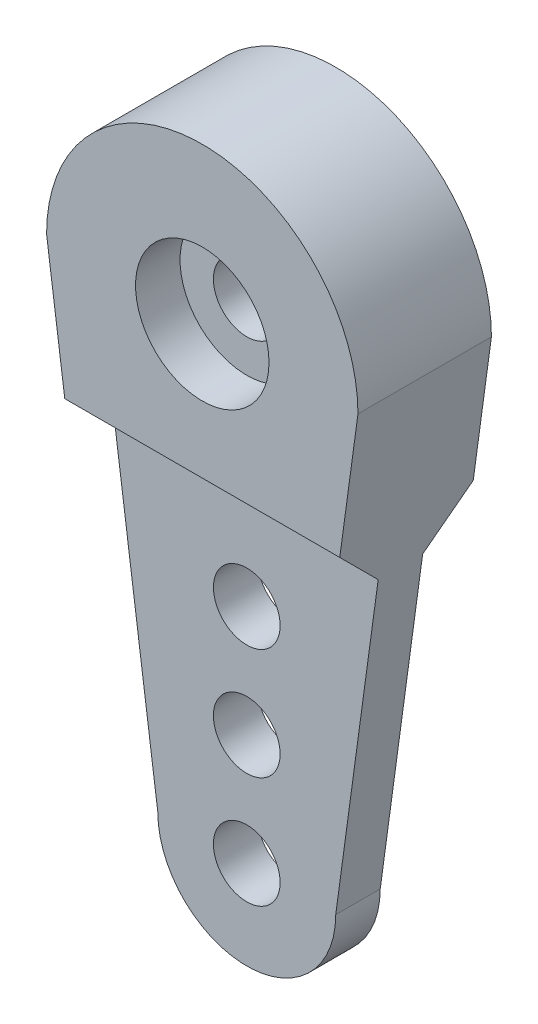
ISO-10303-21;
HEADER;
FILE_DESCRIPTION(('STEP AP214'),'2;1');
FILE_NAME('part.step','',(''),(''),'','','');
FILE_SCHEMA(('AUTOMOTIVE_DESIGN { 1 0 10303 214 1 1 1 1 }'));
ENDSEC;
DATA;
#1=APPLICATION_CONTEXT('core data for automotive mechanical design processes');
#2=APPLICATION_PROTOCOL_DEFINITION('international standard','automotive_design',2000,#1);
#3=PRODUCT_CONTEXT('',#1,'mechanical');
#4=PRODUCT('Part','Part','',(#3));
#5=PRODUCT_RELATED_PRODUCT_CATEGORY('part','',(#4));
#6=PRODUCT_DEFINITION_FORMATION('','',#4);
#7=PRODUCT_DEFINITION_CONTEXT('part definition',#1,'design');
#8=PRODUCT_DEFINITION('design','',#6,#7);
#9=PRODUCT_DEFINITION_SHAPE('','',#8);
#10=(LENGTH_UNIT() NAMED_UNIT(*) SI_UNIT(.MILLI.,.METRE.));
#11=(NAMED_UNIT(*) PLANE_ANGLE_UNIT() SI_UNIT($,.RADIAN.));
#12=(NAMED_UNIT(*) SI_UNIT($,.STERADIAN.) SOLID_ANGLE_UNIT());
#13=UNCERTAINTY_MEASURE_WITH_UNIT(LENGTH_MEASURE(1.E-05),#10,'distance_accuracy_value','');
#14=(GEOMETRIC_REPRESENTATION_CONTEXT(3) GLOBAL_UNCERTAINTY_ASSIGNED_CONTEXT((#13)) GLOBAL_UNIT_ASSIGNED_CONTEXT((#10,
#11,#12)) REPRESENTATION_CONTEXT('',''));
#15=CARTESIAN_POINT('',(0.,0.,0.));
#16=DIRECTION('',(0.,0.,1.));
#17=DIRECTION('',(1.,0.,0.));
#18=AXIS2_PLACEMENT_3D('',#15,#16,#17);
#19=CARTESIAN_POINT('',(0.,0.,1.));
#20=DIRECTION('',(0.,0.,-1.));
#21=DIRECTION('',(-1.,0.,0.));
#22=AXIS2_PLACEMENT_3D('',#19,#20,#21);
#23=CYLINDRICAL_SURFACE('',#22,7.);
#24=DIRECTION('',(0.,0.,-1.));
#25=VECTOR('',#24,1.);
#26=CARTESIAN_POINT('',(7.,0.,1.));
#27=LINE('',#26,#25);
#28=CARTESIAN_POINT('',(7.,0.,3.));
#29=VERTEX_POINT('',#28);
#30=CARTESIAN_POINT('',(7.,0.,-3.));
#31=VERTEX_POINT('',#30);
#32=EDGE_CURVE('E183',#29,#31,#27,.T.);
#33=ORIENTED_EDGE('',*,*,#32,.T.);
#34=CARTESIAN_POINT('',(0.,0.,-3.));
#35=DIRECTION('',(0.,0.,1.));
#36=DIRECTION('',(1.,0.,0.));
#37=AXIS2_PLACEMENT_3D('',#34,#35,#36);
#38=CIRCLE('',#37,7.);
#39=CARTESIAN_POINT('',(-7.,0.,-3.));
#40=VERTEX_POINT('',#39);
#41=EDGE_CURVE('E122',#31,#40,#38,.T.);
#42=ORIENTED_EDGE('',*,*,#41,.T.);
#43=DIRECTION('',(0.,0.,-1.));
#44=VECTOR('',#43,1.);
#45=CARTESIAN_POINT('',(-7.,0.,1.));
#46=LINE('',#45,#44);
#47=CARTESIAN_POINT('',(-7.,0.,3.));
#48=VERTEX_POINT('',#47);
#49=EDGE_CURVE('E116',#48,#40,#46,.T.);
#50=ORIENTED_EDGE('',*,*,#49,.F.);
#51=CARTESIAN_POINT('',(0.,0.,3.));
#52=DIRECTION('',(0.,0.,1.));
#53=DIRECTION('',(1.,0.,0.));
#54=AXIS2_PLACEMENT_3D('',#51,#52,#53);
#55=CIRCLE('',#54,7.);
#56=EDGE_CURVE('E120',#29,#48,#55,.T.);
#57=ORIENTED_EDGE('',*,*,#56,.F.);
#58=EDGE_LOOP('',(#33,#42,#50,#57));
#59=FACE_BOUND('',#58,.T.);
#60=ADVANCED_FACE('F48',(#59),#23,.T.);
#61=CARTESIAN_POINT('',(-7.,0.,1.));
#62=DIRECTION('',(0.990830168044299,0.135113204733313,0.));
#63=DIRECTION('',(-0.135113204733313,0.990830168044299,0.));
#64=AXIS2_PLACEMENT_3D('',#61,#62,#63);
#65=PLANE('',#64);
#66=DIRECTION('',(0.135113204733313,-0.990830168044299,0.));
#67=VECTOR('',#66,1.);
#68=CARTESIAN_POINT('',(-7.,0.,1.));
#69=LINE('',#68,#67);
#70=CARTESIAN_POINT('',(-5.90909090909091,-8.,1.));
#71=VERTEX_POINT('',#70);
#72=CARTESIAN_POINT('',(-4.,-22.,1.));
#73=VERTEX_POINT('',#72);
#74=EDGE_CURVE('E172',#71,#73,#69,.T.);
#75=ORIENTED_EDGE('',*,*,#74,.F.);
#76=DIRECTION('',(-0.0959785032226474,0.703842356966081,0.703842356966084));
#77=VECTOR('',#76,1.);
#78=CARTESIAN_POINT('',(-6.12487205731832,-6.41760491299897,2.58239508700102));
#79=LINE('',#78,#77);
#80=CARTESIAN_POINT('',(-6.18181818181818,-6.,3.));
#81=VERTEX_POINT('',#80);
#82=EDGE_CURVE('E59',#71,#81,#79,.T.);
#83=ORIENTED_EDGE('',*,*,#82,.T.);
#84=DIRECTION('',(0.135113204733314,-0.990830168044299,0.));
#85=VECTOR('',#84,1.);
#86=CARTESIAN_POINT('',(-7.,0.,3.));
#87=LINE('',#86,#85);
#88=EDGE_CURVE('E129',#48,#81,#87,.T.);
#89=ORIENTED_EDGE('',*,*,#88,.F.);
#90=ORIENTED_EDGE('',*,*,#49,.T.);
#91=DIRECTION('',(0.135113204733314,-0.990830168044299,0.));
#92=VECTOR('',#91,1.);
#93=CARTESIAN_POINT('',(-7.,0.,-3.));
#94=LINE('',#93,#92);
#95=CARTESIAN_POINT('',(-6.18181818181818,-5.99999999999999,-3.));
#96=VERTEX_POINT('',#95);
#97=EDGE_CURVE('E149',#40,#96,#94,.T.);
#98=ORIENTED_EDGE('',*,*,#97,.T.);
#99=DIRECTION('',(-0.0959785032226477,0.703842356966084,-0.703842356966081));
#100=VECTOR('',#99,1.);
#101=CARTESIAN_POINT('',(-5.90909090909091,-8.,-0.999999999999995));
#102=LINE('',#101,#100);
#103=CARTESIAN_POINT('',(-5.90909090909091,-8.,-1.));
#104=VERTEX_POINT('',#103);
#105=EDGE_CURVE('E213',#96,#104,#102,.F.);
#106=ORIENTED_EDGE('',*,*,#105,.T.);
#107=DIRECTION('',(0.135113204733313,-0.990830168044299,0.));
#108=VECTOR('',#107,1.);
#109=CARTESIAN_POINT('',(-7.,0.,-1.));
#110=LINE('',#109,#108);
#111=CARTESIAN_POINT('',(-4.,-22.,-1.));
#112=VERTEX_POINT('',#111);
#113=EDGE_CURVE('E171',#104,#112,#110,.T.);
#114=ORIENTED_EDGE('',*,*,#113,.T.);
#115=DIRECTION('',(0.,0.,-1.));
#116=VECTOR('',#115,1.);
#117=CARTESIAN_POINT('',(-4.,-22.,1.));
#118=LINE('',#117,#116);
#119=EDGE_CURVE('E126',#73,#112,#118,.T.);
#120=ORIENTED_EDGE('',*,*,#119,.F.);
#121=EDGE_LOOP('',(#75,#83,#89,#90,#98,#106,#114,#120));
#122=FACE_BOUND('',#121,.T.);
#123=ADVANCED_FACE('F131',(#122),#65,.F.);
#124=CARTESIAN_POINT('',(0.,-22.,1.));
#125=DIRECTION('',(0.,0.,-1.));
#126=DIRECTION('',(-1.,0.,0.));
#127=AXIS2_PLACEMENT_3D('',#124,#125,#126);
#128=CYLINDRICAL_SURFACE('',#127,4.);
#129=CARTESIAN_POINT('',(0.,-22.,-1.));
#130=DIRECTION('',(0.,0.,1.));
#131=DIRECTION('',(1.,0.,0.));
#132=AXIS2_PLACEMENT_3D('',#129,#130,#131);
#133=CIRCLE('',#132,4.);
#134=CARTESIAN_POINT('',(4.,-22.,-1.));
#135=VERTEX_POINT('',#134);
#136=EDGE_CURVE('E186',#112,#135,#133,.T.);
#137=ORIENTED_EDGE('',*,*,#136,.T.);
#138=DIRECTION('',(0.,0.,-1.));
#139=VECTOR('',#138,1.);
#140=CARTESIAN_POINT('',(4.,-22.,1.));
#141=LINE('',#140,#139);
#142=CARTESIAN_POINT('',(4.,-22.,1.));
#143=VERTEX_POINT('',#142);
#144=EDGE_CURVE('E193',#143,#135,#141,.T.);
#145=ORIENTED_EDGE('',*,*,#144,.F.);
#146=CARTESIAN_POINT('',(0.,-22.,1.));
#147=DIRECTION('',(0.,0.,1.));
#148=DIRECTION('',(1.,0.,0.));
#149=AXIS2_PLACEMENT_3D('',#146,#147,#148);
#150=CIRCLE('',#149,4.);
#151=EDGE_CURVE('E175',#73,#143,#150,.T.);
#152=ORIENTED_EDGE('',*,*,#151,.F.);
#153=ORIENTED_EDGE('',*,*,#119,.T.);
#154=EDGE_LOOP('',(#137,#145,#152,#153));
#155=FACE_BOUND('',#154,.T.);
#156=ADVANCED_FACE('F282',(#155),#128,.T.);
#157=CARTESIAN_POINT('',(7.,0.,1.));
#158=DIRECTION('',(-0.990830168044299,0.135113204733313,0.));
#159=DIRECTION('',(-0.135113204733313,-0.990830168044299,0.));
#160=AXIS2_PLACEMENT_3D('',#157,#158,#159);
#161=PLANE('',#160);
#162=DIRECTION('',(0.135113204733313,0.990830168044299,0.));
#163=VECTOR('',#162,1.);
#164=CARTESIAN_POINT('',(5.90909090909091,-8.,3.));
#165=LINE('',#164,#163);
#166=CARTESIAN_POINT('',(6.18181818181818,-5.99999999999999,3.));
#167=VERTEX_POINT('',#166);
#168=EDGE_CURVE('E137',#167,#29,#165,.T.);
#169=ORIENTED_EDGE('',*,*,#168,.F.);
#170=DIRECTION('',(-0.0959785032226474,-0.703842356966081,-0.703842356966084));
#171=VECTOR('',#170,1.);
#172=CARTESIAN_POINT('',(6.12487205731832,-6.41760491299897,2.58239508700102));
#173=LINE('',#172,#171);
#174=CARTESIAN_POINT('',(5.90909090909091,-8.,1.));
#175=VERTEX_POINT('',#174);
#176=EDGE_CURVE('E210',#167,#175,#173,.T.);
#177=ORIENTED_EDGE('',*,*,#176,.T.);
#178=DIRECTION('',(0.135113204733313,0.990830168044299,0.));
#179=VECTOR('',#178,1.);
#180=CARTESIAN_POINT('',(7.,0.,1.));
#181=LINE('',#180,#179);
#182=EDGE_CURVE('E179',#143,#175,#181,.T.);
#183=ORIENTED_EDGE('',*,*,#182,.F.);
#184=ORIENTED_EDGE('',*,*,#144,.T.);
#185=DIRECTION('',(0.135113204733313,0.990830168044299,0.));
#186=VECTOR('',#185,1.);
#187=CARTESIAN_POINT('',(7.,0.,-1.));
#188=LINE('',#187,#186);
#189=CARTESIAN_POINT('',(5.90909090909091,-8.,-1.));
#190=VERTEX_POINT('',#189);
#191=EDGE_CURVE('E176',#135,#190,#188,.T.);
#192=ORIENTED_EDGE('',*,*,#191,.T.);
#193=DIRECTION('',(-0.0959785032226477,-0.703842356966084,0.703842356966081));
#194=VECTOR('',#193,1.);
#195=CARTESIAN_POINT('',(5.80022331813529,-8.79836233367452,-0.201637666325481));
#196=LINE('',#195,#194);
#197=CARTESIAN_POINT('',(6.18181818181818,-5.99999999999999,-3.));
#198=VERTEX_POINT('',#197);
#199=EDGE_CURVE('E73',#190,#198,#196,.F.);
#200=ORIENTED_EDGE('',*,*,#199,.T.);
#201=DIRECTION('',(0.135113204733313,0.990830168044299,0.));
#202=VECTOR('',#201,1.);
#203=CARTESIAN_POINT('',(5.90909090909091,-8.,-3.));
#204=LINE('',#203,#202);
#205=EDGE_CURVE('E144',#198,#31,#204,.T.);
#206=ORIENTED_EDGE('',*,*,#205,.T.);
#207=ORIENTED_EDGE('',*,*,#32,.F.);
#208=EDGE_LOOP('',(#169,#177,#183,#184,#192,#200,#206,#207));
#209=FACE_BOUND('',#208,.T.);
#210=ADVANCED_FACE('F301',(#209),#161,.F.);
#211=CARTESIAN_POINT('',(0.,0.,1.));
#212=DIRECTION('',(0.,0.,1.));
#213=DIRECTION('',(1.,0.,0.));
#214=AXIS2_PLACEMENT_3D('',#211,#212,#213);
#215=PLANE('',#214);
#216=CARTESIAN_POINT('',(0.,-22.,1.));
#217=DIRECTION('',(0.,0.,1.));
#218=DIRECTION('',(1.,0.,0.));
#219=AXIS2_PLACEMENT_3D('',#216,#217,#218);
#220=CIRCLE('',#219,1.5);
#221=CARTESIAN_POINT('',(1.5,-22.,1.));
#222=VERTEX_POINT('',#221);
#223=EDGE_CURVE('E223',#222,#222,#220,.T.);
#224=ORIENTED_EDGE('',*,*,#223,.F.);
#225=EDGE_LOOP('',(#224));
#226=FACE_BOUND('',#225,.T.);
#227=CARTESIAN_POINT('',(0.,-17.,1.));
#228=DIRECTION('',(0.,0.,1.));
#229=DIRECTION('',(1.,0.,0.));
#230=AXIS2_PLACEMENT_3D('',#227,#228,#229);
#231=CIRCLE('',#230,1.5);
#232=CARTESIAN_POINT('',(1.5,-17.,1.));
#233=VERTEX_POINT('',#232);
#234=EDGE_CURVE('E246',#233,#233,#231,.T.);
#235=ORIENTED_EDGE('',*,*,#234,.F.);
#236=EDGE_LOOP('',(#235));
#237=FACE_BOUND('',#236,.T.);
#238=CARTESIAN_POINT('',(0.,-12.,1.));
#239=DIRECTION('',(0.,0.,1.));
#240=DIRECTION('',(1.,0.,0.));
#241=AXIS2_PLACEMENT_3D('',#238,#239,#240);
#242=CIRCLE('',#241,1.5);
#243=CARTESIAN_POINT('',(1.5,-12.,1.));
#244=VERTEX_POINT('',#243);
#245=EDGE_CURVE('E243',#244,#244,#242,.T.);
#246=ORIENTED_EDGE('',*,*,#245,.F.);
#247=EDGE_LOOP('',(#246));
#248=FACE_BOUND('',#247,.T.);
#249=ORIENTED_EDGE('',*,*,#182,.T.);
#250=DIRECTION('',(-1.,0.,0.));
#251=VECTOR('',#250,1.);
#252=CARTESIAN_POINT('',(0.,-8.,1.));
#253=LINE('',#252,#251);
#254=EDGE_CURVE('E168',#175,#71,#253,.T.);
#255=ORIENTED_EDGE('',*,*,#254,.T.);
#256=ORIENTED_EDGE('',*,*,#74,.T.);
#257=ORIENTED_EDGE('',*,*,#151,.T.);
#258=EDGE_LOOP('',(#249,#255,#256,#257));
#259=FACE_BOUND('',#258,.T.);
#260=ADVANCED_FACE('F315',(#226,#237,#248,#259),#215,.T.);
#261=CARTESIAN_POINT('',(0.,0.,-1.));
#262=DIRECTION('',(0.,0.,1.));
#263=DIRECTION('',(1.,0.,0.));
#264=AXIS2_PLACEMENT_3D('',#261,#262,#263);
#265=PLANE('',#264);
#266=CARTESIAN_POINT('',(0.,-22.,-1.));
#267=DIRECTION('',(0.,0.,1.));
#268=DIRECTION('',(1.,0.,0.));
#269=AXIS2_PLACEMENT_3D('',#266,#267,#268);
#270=CIRCLE('',#269,1.5);
#271=CARTESIAN_POINT('',(1.5,-22.,-1.));
#272=VERTEX_POINT('',#271);
#273=EDGE_CURVE('E226',#272,#272,#270,.T.);
#274=ORIENTED_EDGE('',*,*,#273,.T.);
#275=EDGE_LOOP('',(#274));
#276=FACE_BOUND('',#275,.T.);
#277=CARTESIAN_POINT('',(0.,-17.,-1.));
#278=DIRECTION('',(0.,0.,1.));
#279=DIRECTION('',(1.,0.,0.));
#280=AXIS2_PLACEMENT_3D('',#277,#278,#279);
#281=CIRCLE('',#280,1.5);
#282=CARTESIAN_POINT('',(1.5,-17.,-1.));
#283=VERTEX_POINT('',#282);
#284=EDGE_CURVE('E222',#283,#283,#281,.T.);
#285=ORIENTED_EDGE('',*,*,#284,.T.);
#286=EDGE_LOOP('',(#285));
#287=FACE_BOUND('',#286,.T.);
#288=CARTESIAN_POINT('',(0.,-12.,-1.));
#289=DIRECTION('',(0.,0.,1.));
#290=DIRECTION('',(1.,0.,0.));
#291=AXIS2_PLACEMENT_3D('',#288,#289,#290);
#292=CIRCLE('',#291,1.5);
#293=CARTESIAN_POINT('',(1.5,-12.,-1.));
#294=VERTEX_POINT('',#293);
#295=EDGE_CURVE('E218',#294,#294,#292,.T.);
#296=ORIENTED_EDGE('',*,*,#295,.T.);
#297=EDGE_LOOP('',(#296));
#298=FACE_BOUND('',#297,.T.);
#299=DIRECTION('',(-1.,0.,0.));
#300=VECTOR('',#299,1.);
#301=CARTESIAN_POINT('',(0.,-8.,-1.));
#302=LINE('',#301,#300);
#303=EDGE_CURVE('E125',#190,#104,#302,.T.);
#304=ORIENTED_EDGE('',*,*,#303,.F.);
#305=ORIENTED_EDGE('',*,*,#191,.F.);
#306=ORIENTED_EDGE('',*,*,#136,.F.);
#307=ORIENTED_EDGE('',*,*,#113,.F.);
#308=EDGE_LOOP('',(#304,#305,#306,#307));
#309=FACE_BOUND('',#308,.T.);
#310=ADVANCED_FACE('F299',(#276,#287,#298,#309),#265,.F.);
#311=CARTESIAN_POINT('',(0.,0.,-3.));
#312=DIRECTION('',(0.,0.,1.));
#313=DIRECTION('',(1.,0.,0.));
#314=AXIS2_PLACEMENT_3D('',#311,#312,#313);
#315=PLANE('',#314);
#316=ORIENTED_EDGE('',*,*,#205,.F.);
#317=DIRECTION('',(-1.,0.,0.));
#318=VECTOR('',#317,1.);
#319=CARTESIAN_POINT('',(0.,-5.99999999999999,-3.));
#320=LINE('',#319,#318);
#321=EDGE_CURVE('E11',#198,#96,#320,.T.);
#322=ORIENTED_EDGE('',*,*,#321,.T.);
#323=ORIENTED_EDGE('',*,*,#97,.F.);
#324=ORIENTED_EDGE('',*,*,#41,.F.);
#325=EDGE_LOOP('',(#316,#322,#323,#324));
#326=FACE_BOUND('',#325,.T.);
#327=CARTESIAN_POINT('',(0.,0.,-3.));
#328=DIRECTION('',(0.,0.,1.));
#329=DIRECTION('',(1.,0.,0.));
#330=AXIS2_PLACEMENT_3D('',#327,#328,#329);
#331=CIRCLE('',#330,3.);
#332=CARTESIAN_POINT('',(3.,0.,-3.));
#333=VERTEX_POINT('',#332);
#334=EDGE_CURVE('E152',#333,#333,#331,.T.);
#335=ORIENTED_EDGE('',*,*,#334,.T.);
#336=EDGE_LOOP('',(#335));
#337=FACE_BOUND('',#336,.T.);
#338=ADVANCED_FACE('F303',(#326,#337),#315,.F.);
#339=CARTESIAN_POINT('',(0.,0.,3.));
#340=DIRECTION('',(0.,0.,-1.));
#341=DIRECTION('',(-1.,0.,0.));
#342=AXIS2_PLACEMENT_3D('',#339,#340,#341);
#343=CYLINDRICAL_SURFACE('',#342,3.);
#344=ORIENTED_EDGE('',*,*,#334,.F.);
#345=EDGE_LOOP('',(#344));
#346=FACE_BOUND('',#345,.T.);
#347=CARTESIAN_POINT('',(0.,0.,-1.));
#348=DIRECTION('',(0.,0.,1.));
#349=DIRECTION('',(1.,0.,0.));
#350=AXIS2_PLACEMENT_3D('',#347,#348,#349);
#351=CIRCLE('',#350,3.);
#352=CARTESIAN_POINT('',(3.,0.,-1.));
#353=VERTEX_POINT('',#352);
#354=EDGE_CURVE('E157',#353,#353,#351,.F.);
#355=ORIENTED_EDGE('',*,*,#354,.F.);
#356=EDGE_LOOP('',(#355));
#357=FACE_BOUND('',#356,.T.);
#358=ADVANCED_FACE('F335',(#346,#357),#343,.F.);
#359=CARTESIAN_POINT('',(0.,0.,3.));
#360=DIRECTION('',(0.,0.,1.));
#361=DIRECTION('',(1.,0.,0.));
#362=AXIS2_PLACEMENT_3D('',#359,#360,#361);
#363=PLANE('',#362);
#364=ORIENTED_EDGE('',*,*,#88,.T.);
#365=DIRECTION('',(1.,0.,0.));
#366=VECTOR('',#365,1.);
#367=CARTESIAN_POINT('',(5.90909090909091,-5.99999999999999,3.));
#368=LINE('',#367,#366);
#369=EDGE_CURVE('E167',#81,#167,#368,.T.);
#370=ORIENTED_EDGE('',*,*,#369,.T.);
#371=ORIENTED_EDGE('',*,*,#168,.T.);
#372=ORIENTED_EDGE('',*,*,#56,.T.);
#373=EDGE_LOOP('',(#364,#370,#371,#372));
#374=FACE_BOUND('',#373,.T.);
#375=CARTESIAN_POINT('',(0.,0.,3.));
#376=DIRECTION('',(0.,0.,1.));
#377=DIRECTION('',(1.,0.,0.));
#378=AXIS2_PLACEMENT_3D('',#375,#376,#377);
#379=CIRCLE('',#378,3.);
#380=CARTESIAN_POINT('',(3.,0.,3.));
#381=VERTEX_POINT('',#380);
#382=EDGE_CURVE('E160',#381,#381,#379,.T.);
#383=ORIENTED_EDGE('',*,*,#382,.F.);
#384=EDGE_LOOP('',(#383));
#385=FACE_BOUND('',#384,.T.);
#386=ADVANCED_FACE('F139',(#374,#385),#363,.T.);
#387=CARTESIAN_POINT('',(0.,0.,1.));
#388=DIRECTION('',(0.,0.,1.));
#389=DIRECTION('',(1.,0.,0.));
#390=AXIS2_PLACEMENT_3D('',#387,#388,#389);
#391=CIRCLE('',#390,3.);
#392=CARTESIAN_POINT('',(3.,0.,1.));
#393=VERTEX_POINT('',#392);
#394=EDGE_CURVE('E163',#393,#393,#391,.F.);
#395=ORIENTED_EDGE('',*,*,#394,.T.);
#396=EDGE_LOOP('',(#395));
#397=FACE_BOUND('',#396,.T.);
#398=ORIENTED_EDGE('',*,*,#382,.T.);
#399=EDGE_LOOP('',(#398));
#400=FACE_BOUND('',#399,.T.);
#401=ADVANCED_FACE('F328',(#397,#400),#343,.F.);
#402=CARTESIAN_POINT('',(0.,0.,1.));
#403=DIRECTION('',(0.,0.,1.));
#404=DIRECTION('',(1.,0.,0.));
#405=AXIS2_PLACEMENT_3D('',#402,#403,#404);
#406=CIRCLE('',#405,1.5);
#407=CARTESIAN_POINT('',(1.5,0.,1.));
#408=VERTEX_POINT('',#407);
#409=EDGE_CURVE('E253',#408,#408,#406,.T.);
#410=ORIENTED_EDGE('',*,*,#409,.F.);
#411=EDGE_LOOP('',(#410));
#412=FACE_BOUND('',#411,.T.);
#413=ORIENTED_EDGE('',*,*,#394,.F.);
#414=EDGE_LOOP('',(#413));
#415=FACE_BOUND('',#414,.T.);
#416=ADVANCED_FACE('F297',(#412,#415),#215,.T.);
#417=CARTESIAN_POINT('',(0.,0.,-1.));
#418=DIRECTION('',(0.,0.,1.));
#419=DIRECTION('',(1.,0.,0.));
#420=AXIS2_PLACEMENT_3D('',#417,#418,#419);
#421=CIRCLE('',#420,1.5);
#422=CARTESIAN_POINT('',(1.5,0.,-1.));
#423=VERTEX_POINT('',#422);
#424=EDGE_CURVE('E53',#423,#423,#421,.T.);
#425=ORIENTED_EDGE('',*,*,#424,.T.);
#426=EDGE_LOOP('',(#425));
#427=FACE_BOUND('',#426,.T.);
#428=ORIENTED_EDGE('',*,*,#354,.T.);
#429=EDGE_LOOP('',(#428));
#430=FACE_BOUND('',#429,.T.);
#431=ADVANCED_FACE('F264',(#427,#430),#265,.F.);
#432=CARTESIAN_POINT('',(0.,-5.99999999999999,3.));
#433=DIRECTION('',(0.,-0.707106781186549,0.707106781186546));
#434=DIRECTION('',(-1.,0.,0.));
#435=AXIS2_PLACEMENT_3D('',#432,#433,#434);
#436=PLANE('',#435);
#437=ORIENTED_EDGE('',*,*,#82,.F.);
#438=ORIENTED_EDGE('',*,*,#254,.F.);
#439=ORIENTED_EDGE('',*,*,#176,.F.);
#440=ORIENTED_EDGE('',*,*,#369,.F.);
#441=EDGE_LOOP('',(#437,#438,#439,#440));
#442=FACE_BOUND('',#441,.T.);
#443=ADVANCED_FACE('F286',(#442),#436,.T.);
#444=CARTESIAN_POINT('',(-5.90909090909091,-8.,-0.999999999999995));
#445=DIRECTION('',(0.,0.707106781186546,0.707106781186549));
#446=DIRECTION('',(1.,0.,0.));
#447=AXIS2_PLACEMENT_3D('',#444,#445,#446);
#448=PLANE('',#447);
#449=ORIENTED_EDGE('',*,*,#105,.F.);
#450=ORIENTED_EDGE('',*,*,#321,.F.);
#451=ORIENTED_EDGE('',*,*,#199,.F.);
#452=ORIENTED_EDGE('',*,*,#303,.T.);
#453=EDGE_LOOP('',(#449,#450,#451,#452));
#454=FACE_BOUND('',#453,.T.);
#455=ADVANCED_FACE('F51',(#454),#448,.F.);
#456=CARTESIAN_POINT('',(0.,-12.,-3.));
#457=DIRECTION('',(0.,0.,1.));
#458=DIRECTION('',(1.,0.,0.));
#459=AXIS2_PLACEMENT_3D('',#456,#457,#458);
#460=CYLINDRICAL_SURFACE('',#459,1.5);
#461=ORIENTED_EDGE('',*,*,#245,.T.);
#462=EDGE_LOOP('',(#461));
#463=FACE_BOUND('',#462,.T.);
#464=ORIENTED_EDGE('',*,*,#295,.F.);
#465=EDGE_LOOP('',(#464));
#466=FACE_BOUND('',#465,.T.);
#467=ADVANCED_FACE('F295',(#463,#466),#460,.F.);
#468=CARTESIAN_POINT('',(0.,-17.,-3.));
#469=DIRECTION('',(0.,0.,1.));
#470=DIRECTION('',(1.,0.,0.));
#471=AXIS2_PLACEMENT_3D('',#468,#469,#470);
#472=CYLINDRICAL_SURFACE('',#471,1.5);
#473=ORIENTED_EDGE('',*,*,#234,.T.);
#474=EDGE_LOOP('',(#473));
#475=FACE_BOUND('',#474,.T.);
#476=ORIENTED_EDGE('',*,*,#284,.F.);
#477=EDGE_LOOP('',(#476));
#478=FACE_BOUND('',#477,.T.);
#479=ADVANCED_FACE('F274',(#475,#478),#472,.F.);
#480=CARTESIAN_POINT('',(0.,-22.,-3.));
#481=DIRECTION('',(0.,0.,1.));
#482=DIRECTION('',(1.,0.,0.));
#483=AXIS2_PLACEMENT_3D('',#480,#481,#482);
#484=CYLINDRICAL_SURFACE('',#483,1.5);
#485=ORIENTED_EDGE('',*,*,#223,.T.);
#486=EDGE_LOOP('',(#485));
#487=FACE_BOUND('',#486,.T.);
#488=ORIENTED_EDGE('',*,*,#273,.F.);
#489=EDGE_LOOP('',(#488));
#490=FACE_BOUND('',#489,.T.);
#491=ADVANCED_FACE('F269',(#487,#490),#484,.F.);
#492=CARTESIAN_POINT('',(0.,0.,-3.));
#493=DIRECTION('',(0.,0.,1.));
#494=DIRECTION('',(1.,0.,0.));
#495=AXIS2_PLACEMENT_3D('',#492,#493,#494);
#496=CYLINDRICAL_SURFACE('',#495,1.5);
#497=ORIENTED_EDGE('',*,*,#409,.T.);
#498=EDGE_LOOP('',(#497));
#499=FACE_BOUND('',#498,.T.);
#500=ORIENTED_EDGE('',*,*,#424,.F.);
#501=EDGE_LOOP('',(#500));
#502=FACE_BOUND('',#501,.T.);
#503=ADVANCED_FACE('F267',(#499,#502),#496,.F.);
#504=CLOSED_SHELL('',(#60,#123,#156,#210,#260,#310,#338,#358,#386,#401,#416,#431,#443,#455,#467,
#479,#491,#503));
#505=MANIFOLD_SOLID_BREP('B2',#504);
#506=ADVANCED_BREP_SHAPE_REPRESENTATION('',(#18,#505),#14);
#507=SHAPE_DEFINITION_REPRESENTATION(#9,#506);
ENDSEC;
END-ISO-10303-21;
